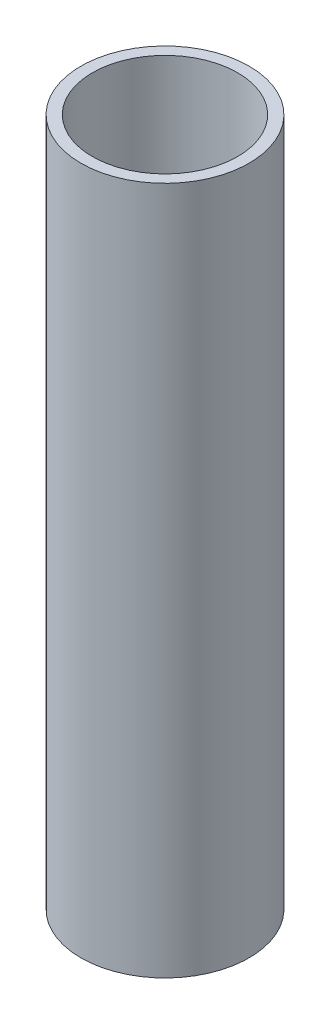
ISO-10303-21;
HEADER;
FILE_DESCRIPTION(('STEP AP214'),'2;1');
FILE_NAME('part.step','',(''),(''),'','','');
FILE_SCHEMA(('AUTOMOTIVE_DESIGN { 1 0 10303 214 1 1 1 1 }'));
ENDSEC;
DATA;
#1=APPLICATION_CONTEXT('core data for automotive mechanical design processes');
#2=APPLICATION_PROTOCOL_DEFINITION('international standard','automotive_design',2000,#1);
#3=PRODUCT_CONTEXT('',#1,'mechanical');
#4=PRODUCT('Part','Part','',(#3));
#5=PRODUCT_RELATED_PRODUCT_CATEGORY('part','',(#4));
#6=PRODUCT_DEFINITION_FORMATION('','',#4);
#7=PRODUCT_DEFINITION_CONTEXT('part definition',#1,'design');
#8=PRODUCT_DEFINITION('design','',#6,#7);
#9=PRODUCT_DEFINITION_SHAPE('','',#8);
#10=(LENGTH_UNIT() NAMED_UNIT(*) SI_UNIT(.MILLI.,.METRE.));
#11=(NAMED_UNIT(*) PLANE_ANGLE_UNIT() SI_UNIT($,.RADIAN.));
#12=(NAMED_UNIT(*) SI_UNIT($,.STERADIAN.) SOLID_ANGLE_UNIT());
#13=UNCERTAINTY_MEASURE_WITH_UNIT(LENGTH_MEASURE(1.E-05),#10,'distance_accuracy_value','');
#14=(GEOMETRIC_REPRESENTATION_CONTEXT(3) GLOBAL_UNCERTAINTY_ASSIGNED_CONTEXT((#13)) GLOBAL_UNIT_ASSIGNED_CONTEXT((#10,
#11,#12)) REPRESENTATION_CONTEXT('',''));
#15=CARTESIAN_POINT('',(0.,0.,0.));
#16=DIRECTION('',(0.,0.,1.));
#17=DIRECTION('',(1.,0.,0.));
#18=AXIS2_PLACEMENT_3D('',#15,#16,#17);
#19=CARTESIAN_POINT('',(0.,90.,0.));
#20=DIRECTION('',(0.,1.,0.));
#21=DIRECTION('',(0.,0.,1.));
#22=AXIS2_PLACEMENT_3D('',#19,#20,#21);
#23=PLANE('',#22);
#24=CARTESIAN_POINT('',(0.,90.,0.));
#25=DIRECTION('',(0.,1.,0.));
#26=DIRECTION('',(0.,0.,1.));
#27=AXIS2_PLACEMENT_3D('',#24,#25,#26);
#28=CIRCLE('',#27,11.);
#29=CARTESIAN_POINT('',(0.,90.,-11.));
#30=VERTEX_POINT('',#29);
#31=EDGE_CURVE('E10',#30,#30,#28,.T.);
#32=ORIENTED_EDGE('',*,*,#31,.T.);
#33=EDGE_LOOP('',(#32));
#34=FACE_BOUND('',#33,.T.);
#35=CARTESIAN_POINT('',(0.,90.,0.));
#36=DIRECTION('',(0.,1.,0.));
#37=DIRECTION('',(0.,0.,1.));
#38=AXIS2_PLACEMENT_3D('',#35,#36,#37);
#39=CIRCLE('',#38,9.5);
#40=CARTESIAN_POINT('',(0.,90.,-9.5));
#41=VERTEX_POINT('',#40);
#42=EDGE_CURVE('E41',#41,#41,#39,.T.);
#43=ORIENTED_EDGE('',*,*,#42,.F.);
#44=EDGE_LOOP('',(#43));
#45=FACE_BOUND('',#44,.T.);
#46=ADVANCED_FACE('F30',(#34,#45),#23,.T.);
#47=CARTESIAN_POINT('',(0.,0.,0.));
#48=DIRECTION('',(0.,1.,0.));
#49=DIRECTION('',(0.,0.,1.));
#50=AXIS2_PLACEMENT_3D('',#47,#48,#49);
#51=PLANE('',#50);
#52=CARTESIAN_POINT('',(0.,0.,0.));
#53=DIRECTION('',(0.,1.,0.));
#54=DIRECTION('',(0.,0.,1.));
#55=AXIS2_PLACEMENT_3D('',#52,#53,#54);
#56=CIRCLE('',#55,11.);
#57=CARTESIAN_POINT('',(0.,0.,-11.));
#58=VERTEX_POINT('',#57);
#59=EDGE_CURVE('E34',#58,#58,#56,.T.);
#60=ORIENTED_EDGE('',*,*,#59,.F.);
#61=EDGE_LOOP('',(#60));
#62=FACE_BOUND('',#61,.T.);
#63=CARTESIAN_POINT('',(0.,0.,0.));
#64=DIRECTION('',(0.,1.,0.));
#65=DIRECTION('',(0.,0.,1.));
#66=AXIS2_PLACEMENT_3D('',#63,#64,#65);
#67=CIRCLE('',#66,9.5);
#68=CARTESIAN_POINT('',(0.,0.,-9.5));
#69=VERTEX_POINT('',#68);
#70=EDGE_CURVE('E43',#69,#69,#67,.T.);
#71=ORIENTED_EDGE('',*,*,#70,.T.);
#72=EDGE_LOOP('',(#71));
#73=FACE_BOUND('',#72,.T.);
#74=ADVANCED_FACE('F53',(#62,#73),#51,.F.);
#75=CARTESIAN_POINT('',(0.,90.,0.));
#76=DIRECTION('',(0.,-1.,0.));
#77=DIRECTION('',(0.,0.,-1.));
#78=AXIS2_PLACEMENT_3D('',#75,#76,#77);
#79=CYLINDRICAL_SURFACE('',#78,11.);
#80=CARTESIAN_POINT('',(0.,90.,-11.));
#81=CARTESIAN_POINT('',(0.,89.0625,-11.));
#82=CARTESIAN_POINT('',(0.,88.125,-11.));
#83=CARTESIAN_POINT('',(0.,86.25,-11.));
#84=CARTESIAN_POINT('',(0.,85.3125,-11.));
#85=CARTESIAN_POINT('',(0.,83.4375,-11.));
#86=CARTESIAN_POINT('',(0.,82.5,-11.));
#87=CARTESIAN_POINT('',(0.,80.625,-11.));
#88=CARTESIAN_POINT('',(0.,79.6875,-11.));
#89=CARTESIAN_POINT('',(0.,77.8125,-11.));
#90=CARTESIAN_POINT('',(0.,76.875,-11.));
#91=CARTESIAN_POINT('',(0.,75.,-11.));
#92=CARTESIAN_POINT('',(0.,74.0625,-11.));
#93=CARTESIAN_POINT('',(0.,72.1875,-11.));
#94=CARTESIAN_POINT('',(0.,71.25,-11.));
#95=CARTESIAN_POINT('',(0.,69.375,-11.));
#96=CARTESIAN_POINT('',(0.,68.4375,-11.));
#97=CARTESIAN_POINT('',(0.,66.5625,-11.));
#98=CARTESIAN_POINT('',(0.,65.625,-11.));
#99=CARTESIAN_POINT('',(0.,63.75,-11.));
#100=CARTESIAN_POINT('',(0.,62.8125,-11.));
#101=CARTESIAN_POINT('',(0.,60.9375,-11.));
#102=CARTESIAN_POINT('',(0.,60.,-11.));
#103=CARTESIAN_POINT('',(0.,58.125,-11.));
#104=CARTESIAN_POINT('',(0.,57.1875,-11.));
#105=CARTESIAN_POINT('',(0.,55.3125,-11.));
#106=CARTESIAN_POINT('',(0.,54.375,-11.));
#107=CARTESIAN_POINT('',(0.,52.5,-11.));
#108=CARTESIAN_POINT('',(0.,51.5625,-11.));
#109=CARTESIAN_POINT('',(0.,49.6875,-11.));
#110=CARTESIAN_POINT('',(0.,48.75,-11.));
#111=CARTESIAN_POINT('',(0.,46.875,-11.));
#112=CARTESIAN_POINT('',(0.,45.9375,-11.));
#113=CARTESIAN_POINT('',(0.,44.0625,-11.));
#114=CARTESIAN_POINT('',(0.,43.125,-11.));
#115=CARTESIAN_POINT('',(0.,41.25,-11.));
#116=CARTESIAN_POINT('',(0.,40.3125,-11.));
#117=CARTESIAN_POINT('',(0.,38.4375,-11.));
#118=CARTESIAN_POINT('',(0.,37.5,-11.));
#119=CARTESIAN_POINT('',(0.,35.625,-11.));
#120=CARTESIAN_POINT('',(0.,34.6875,-11.));
#121=CARTESIAN_POINT('',(0.,32.8125,-11.));
#122=CARTESIAN_POINT('',(0.,31.875,-11.));
#123=CARTESIAN_POINT('',(0.,30.,-11.));
#124=CARTESIAN_POINT('',(0.,29.0625,-11.));
#125=CARTESIAN_POINT('',(0.,27.1875,-11.));
#126=CARTESIAN_POINT('',(0.,26.25,-11.));
#127=CARTESIAN_POINT('',(0.,24.375,-11.));
#128=CARTESIAN_POINT('',(0.,23.4375,-11.));
#129=CARTESIAN_POINT('',(0.,21.5625,-11.));
#130=CARTESIAN_POINT('',(0.,20.625,-11.));
#131=CARTESIAN_POINT('',(0.,18.75,-11.));
#132=CARTESIAN_POINT('',(0.,17.8125,-11.));
#133=CARTESIAN_POINT('',(0.,15.9375,-11.));
#134=CARTESIAN_POINT('',(0.,15.,-11.));
#135=CARTESIAN_POINT('',(0.,13.125,-11.));
#136=CARTESIAN_POINT('',(0.,12.1875,-11.));
#137=CARTESIAN_POINT('',(0.,10.3125,-11.));
#138=CARTESIAN_POINT('',(0.,9.37499999999999,-11.));
#139=CARTESIAN_POINT('',(0.,7.49999999999999,-11.));
#140=CARTESIAN_POINT('',(0.,6.56249999999999,-11.));
#141=CARTESIAN_POINT('',(0.,4.68749999999999,-11.));
#142=CARTESIAN_POINT('',(0.,3.74999999999998,-11.));
#143=CARTESIAN_POINT('',(0.,1.87499999999998,-11.));
#144=CARTESIAN_POINT('',(0.,0.937499999999986,-11.));
#145=CARTESIAN_POINT('',(0.,0.,-11.));
#146=B_SPLINE_CURVE_WITH_KNOTS('',3,(#80,#81,#82,#83,#84,#85,#86,#87,#88,#89,#90,#91,#92,#93,
#94,#95,#96,#97,#98,#99,#100,#101,#102,#103,#104,#105,#106,#107,#108,#109,#110,#111,#112,#113,
#114,#115,#116,#117,#118,#119,#120,#121,#122,#123,#124,#125,#126,#127,#128,#129,#130,#131,#132,
#133,#134,#135,#136,#137,#138,#139,#140,#141,#142,#143,#144,#145),.UNSPECIFIED.,.F.,.F.,(4,2,2,
2,2,2,2,2,2,2,2,2,2,2,2,2,2,2,2,2,2,2,2,2,2,2,2,2,2,2,2,2,4),(0.,2.81250000000001,
5.62500000000001,8.43750000000001,11.25,14.0625,16.875,19.6875,22.5,25.3125,28.125,30.9375,
33.75,36.5625,39.375,42.1875,45.,47.8125,50.625,53.4375,56.25,59.0625,61.875,64.6875,67.5,
70.3125,73.125,75.9375,78.75,81.5625,84.375,87.1875,90.),.UNSPECIFIED.);
#147=EDGE_CURVE('BSEAM32',#30,#58,#146,.T.);
#148=ORIENTED_EDGE('',*,*,#31,.F.);
#149=ORIENTED_EDGE('',*,*,#59,.T.);
#150=ORIENTED_EDGE('',*,*,#147,.T.);
#151=ORIENTED_EDGE('',*,*,#147,.F.);
#152=EDGE_LOOP('',(#148,#150,#149,#151));
#153=FACE_BOUND('',#152,.T.);
#154=ADVANCED_FACE('F32',(#153),#79,.T.);
#155=CARTESIAN_POINT('',(0.,90.,0.));
#156=DIRECTION('',(0.,-1.,0.));
#157=DIRECTION('',(0.,0.,-1.));
#158=AXIS2_PLACEMENT_3D('',#155,#156,#157);
#159=CYLINDRICAL_SURFACE('',#158,9.5);
#160=CARTESIAN_POINT('',(0.,90.,-9.5));
#161=CARTESIAN_POINT('',(0.,89.0625,-9.5));
#162=CARTESIAN_POINT('',(0.,88.125,-9.5));
#163=CARTESIAN_POINT('',(0.,86.25,-9.5));
#164=CARTESIAN_POINT('',(0.,85.3125,-9.5));
#165=CARTESIAN_POINT('',(0.,83.4375,-9.5));
#166=CARTESIAN_POINT('',(0.,82.5,-9.5));
#167=CARTESIAN_POINT('',(0.,80.625,-9.5));
#168=CARTESIAN_POINT('',(0.,79.6875,-9.5));
#169=CARTESIAN_POINT('',(0.,77.8125,-9.5));
#170=CARTESIAN_POINT('',(0.,76.875,-9.5));
#171=CARTESIAN_POINT('',(0.,75.,-9.5));
#172=CARTESIAN_POINT('',(0.,74.0625,-9.5));
#173=CARTESIAN_POINT('',(0.,72.1875,-9.5));
#174=CARTESIAN_POINT('',(0.,71.25,-9.5));
#175=CARTESIAN_POINT('',(0.,69.375,-9.5));
#176=CARTESIAN_POINT('',(0.,68.4375,-9.5));
#177=CARTESIAN_POINT('',(0.,66.5625,-9.5));
#178=CARTESIAN_POINT('',(0.,65.625,-9.5));
#179=CARTESIAN_POINT('',(0.,63.75,-9.5));
#180=CARTESIAN_POINT('',(0.,62.8125,-9.5));
#181=CARTESIAN_POINT('',(0.,60.9375,-9.5));
#182=CARTESIAN_POINT('',(0.,60.,-9.5));
#183=CARTESIAN_POINT('',(0.,58.125,-9.5));
#184=CARTESIAN_POINT('',(0.,57.1875,-9.5));
#185=CARTESIAN_POINT('',(0.,55.3125,-9.5));
#186=CARTESIAN_POINT('',(0.,54.375,-9.5));
#187=CARTESIAN_POINT('',(0.,52.5,-9.5));
#188=CARTESIAN_POINT('',(0.,51.5625,-9.5));
#189=CARTESIAN_POINT('',(0.,49.6875,-9.5));
#190=CARTESIAN_POINT('',(0.,48.75,-9.5));
#191=CARTESIAN_POINT('',(0.,46.875,-9.5));
#192=CARTESIAN_POINT('',(0.,45.9375,-9.5));
#193=CARTESIAN_POINT('',(0.,44.0625,-9.5));
#194=CARTESIAN_POINT('',(0.,43.125,-9.5));
#195=CARTESIAN_POINT('',(0.,41.25,-9.5));
#196=CARTESIAN_POINT('',(0.,40.3125,-9.5));
#197=CARTESIAN_POINT('',(0.,38.4375,-9.5));
#198=CARTESIAN_POINT('',(0.,37.5,-9.5));
#199=CARTESIAN_POINT('',(0.,35.625,-9.5));
#200=CARTESIAN_POINT('',(0.,34.6875,-9.5));
#201=CARTESIAN_POINT('',(0.,32.8125,-9.5));
#202=CARTESIAN_POINT('',(0.,31.875,-9.5));
#203=CARTESIAN_POINT('',(0.,30.,-9.5));
#204=CARTESIAN_POINT('',(0.,29.0625,-9.5));
#205=CARTESIAN_POINT('',(0.,27.1875,-9.5));
#206=CARTESIAN_POINT('',(0.,26.25,-9.5));
#207=CARTESIAN_POINT('',(0.,24.375,-9.5));
#208=CARTESIAN_POINT('',(0.,23.4375,-9.5));
#209=CARTESIAN_POINT('',(0.,21.5625,-9.5));
#210=CARTESIAN_POINT('',(0.,20.625,-9.5));
#211=CARTESIAN_POINT('',(0.,18.75,-9.5));
#212=CARTESIAN_POINT('',(0.,17.8125,-9.5));
#213=CARTESIAN_POINT('',(0.,15.9375,-9.5));
#214=CARTESIAN_POINT('',(0.,15.,-9.5));
#215=CARTESIAN_POINT('',(0.,13.125,-9.5));
#216=CARTESIAN_POINT('',(0.,12.1875,-9.5));
#217=CARTESIAN_POINT('',(0.,10.3125,-9.5));
#218=CARTESIAN_POINT('',(0.,9.37499999999999,-9.5));
#219=CARTESIAN_POINT('',(0.,7.49999999999999,-9.5));
#220=CARTESIAN_POINT('',(0.,6.56249999999999,-9.5));
#221=CARTESIAN_POINT('',(0.,4.68749999999999,-9.5));
#222=CARTESIAN_POINT('',(0.,3.74999999999998,-9.5));
#223=CARTESIAN_POINT('',(0.,1.87499999999998,-9.5));
#224=CARTESIAN_POINT('',(0.,0.937499999999986,-9.5));
#225=CARTESIAN_POINT('',(0.,0.,-9.5));
#226=B_SPLINE_CURVE_WITH_KNOTS('',3,(#160,#161,#162,#163,#164,#165,#166,#167,#168,#169,#170,
#171,#172,#173,#174,#175,#176,#177,#178,#179,#180,#181,#182,#183,#184,#185,#186,#187,#188,#189,
#190,#191,#192,#193,#194,#195,#196,#197,#198,#199,#200,#201,#202,#203,#204,#205,#206,#207,#208,
#209,#210,#211,#212,#213,#214,#215,#216,#217,#218,#219,#220,#221,#222,#223,#224,#225),
.UNSPECIFIED.,.F.,.F.,(4,2,2,2,2,2,2,2,2,2,2,2,2,2,2,2,2,2,2,2,2,2,2,2,2,2,2,2,2,2,2,2,4),(0.,
2.81250000000001,5.62500000000001,8.43750000000001,11.25,14.0625,16.875,19.6875,22.5,25.3125,
28.125,30.9375,33.75,36.5625,39.375,42.1875,45.,47.8125,50.625,53.4375,56.25,59.0625,61.875,
64.6875,67.5,70.3125,73.125,75.9375,78.75,81.5625,84.375,87.1875,90.),.UNSPECIFIED.);
#227=EDGE_CURVE('BSEAM49',#41,#69,#226,.T.);
#228=ORIENTED_EDGE('',*,*,#42,.T.);
#229=ORIENTED_EDGE('',*,*,#70,.F.);
#230=ORIENTED_EDGE('',*,*,#227,.T.);
#231=ORIENTED_EDGE('',*,*,#227,.F.);
#232=EDGE_LOOP('',(#228,#230,#229,#231));
#233=FACE_BOUND('',#232,.T.);
#234=ADVANCED_FACE('F49',(#233),#159,.F.);
#235=CLOSED_SHELL('',(#46,#74,#154,#234));
#236=MANIFOLD_SOLID_BREP('B2',#235);
#237=ADVANCED_BREP_SHAPE_REPRESENTATION('',(#18,#236),#14);
#238=SHAPE_DEFINITION_REPRESENTATION(#9,#237);
ENDSEC;
END-ISO-10303-21;
